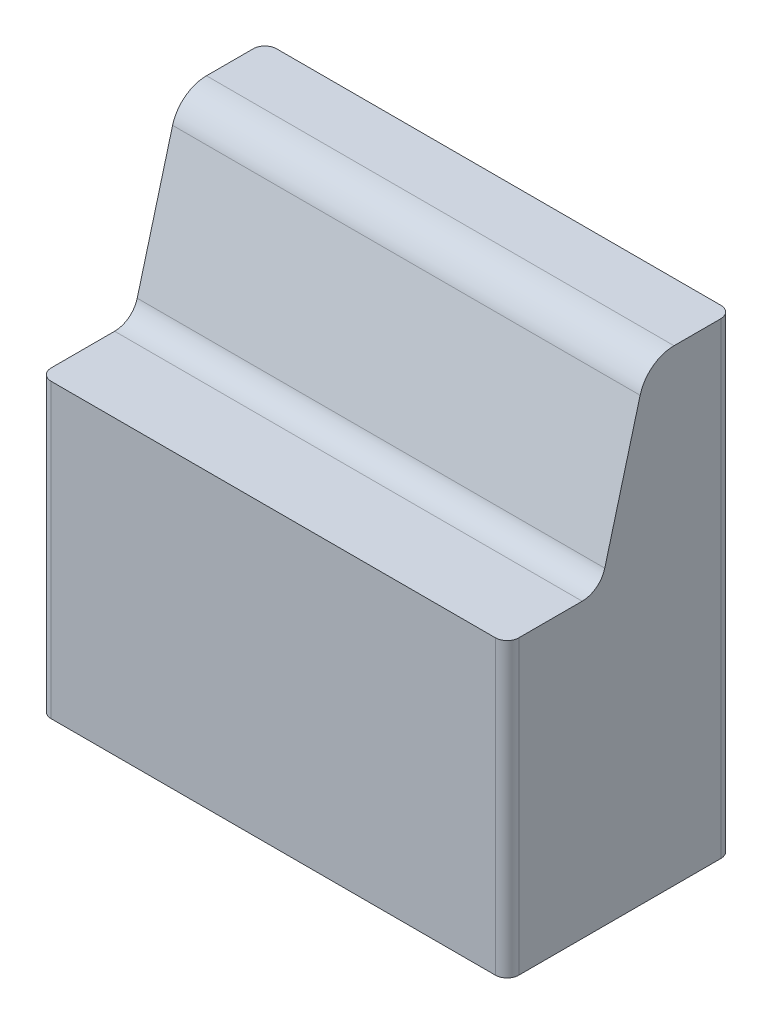
ISO-10303-21;
HEADER;
FILE_DESCRIPTION(('STEP AP214'),'2;1');
FILE_NAME('part.step','',(''),(''),'','','');
FILE_SCHEMA(('AUTOMOTIVE_DESIGN { 1 0 10303 214 1 1 1 1 }'));
ENDSEC;
DATA;
#1=APPLICATION_CONTEXT('core data for automotive mechanical design processes');
#2=APPLICATION_PROTOCOL_DEFINITION('international standard','automotive_design',2000,#1);
#3=PRODUCT_CONTEXT('',#1,'mechanical');
#4=PRODUCT('Part','Part','',(#3));
#5=PRODUCT_RELATED_PRODUCT_CATEGORY('part','',(#4));
#6=PRODUCT_DEFINITION_FORMATION('','',#4);
#7=PRODUCT_DEFINITION_CONTEXT('part definition',#1,'design');
#8=PRODUCT_DEFINITION('design','',#6,#7);
#9=PRODUCT_DEFINITION_SHAPE('','',#8);
#10=(LENGTH_UNIT() NAMED_UNIT(*) SI_UNIT(.MILLI.,.METRE.));
#11=(NAMED_UNIT(*) PLANE_ANGLE_UNIT() SI_UNIT($,.RADIAN.));
#12=(NAMED_UNIT(*) SI_UNIT($,.STERADIAN.) SOLID_ANGLE_UNIT());
#13=UNCERTAINTY_MEASURE_WITH_UNIT(LENGTH_MEASURE(1.E-05),#10,'distance_accuracy_value','');
#14=(GEOMETRIC_REPRESENTATION_CONTEXT(3) GLOBAL_UNCERTAINTY_ASSIGNED_CONTEXT((#13)) GLOBAL_UNIT_ASSIGNED_CONTEXT((#10,
#11,#12)) REPRESENTATION_CONTEXT('',''));
#15=CARTESIAN_POINT('',(0.,0.,0.));
#16=DIRECTION('',(0.,0.,1.));
#17=DIRECTION('',(1.,0.,0.));
#18=AXIS2_PLACEMENT_3D('',#15,#16,#17);
#19=CARTESIAN_POINT('',(20.,-3.,5.));
#20=DIRECTION('',(-1.,0.,0.));
#21=DIRECTION('',(0.,0.,1.));
#22=AXIS2_PLACEMENT_3D('',#19,#20,#21);
#23=CYLINDRICAL_SURFACE('',#22,3.);
#24=CARTESIAN_POINT('',(-20.,-3.,5.));
#25=DIRECTION('',(1.,0.,0.));
#26=DIRECTION('',(0.,0.,1.));
#27=AXIS2_PLACEMENT_3D('',#24,#25,#26);
#28=CIRCLE('',#27,3.);
#29=CARTESIAN_POINT('',(-20.,0.,5.));
#30=VERTEX_POINT('',#29);
#31=CARTESIAN_POINT('',(-20.,-2.22354286469243,7.8977774788672));
#32=VERTEX_POINT('',#31);
#33=EDGE_CURVE('E167',#30,#32,#28,.T.);
#34=ORIENTED_EDGE('',*,*,#33,.T.);
#35=DIRECTION('',(-1.,0.,0.));
#36=VECTOR('',#35,1.);
#37=CARTESIAN_POINT('',(20.,-2.22354286469243,7.8977774788672));
#38=LINE('',#37,#36);
#39=CARTESIAN_POINT('',(20.,-2.22354286469243,7.8977774788672));
#40=VERTEX_POINT('',#39);
#41=EDGE_CURVE('E206',#40,#32,#38,.T.);
#42=ORIENTED_EDGE('',*,*,#41,.F.);
#43=CARTESIAN_POINT('',(20.,-3.,5.));
#44=DIRECTION('',(1.,0.,0.));
#45=DIRECTION('',(0.,0.,1.));
#46=AXIS2_PLACEMENT_3D('',#43,#44,#45);
#47=CIRCLE('',#46,3.);
#48=CARTESIAN_POINT('',(20.,0.,5.));
#49=VERTEX_POINT('',#48);
#50=EDGE_CURVE('E168',#49,#40,#47,.T.);
#51=ORIENTED_EDGE('',*,*,#50,.F.);
#52=DIRECTION('',(-1.,0.,0.));
#53=VECTOR('',#52,1.);
#54=CARTESIAN_POINT('',(20.,0.,5.));
#55=LINE('',#54,#53);
#56=EDGE_CURVE('E181',#49,#30,#55,.T.);
#57=ORIENTED_EDGE('',*,*,#56,.T.);
#58=EDGE_LOOP('',(#34,#42,#51,#57));
#59=FACE_BOUND('',#58,.T.);
#60=ADVANCED_FACE('F50',(#59),#23,.T.);
#61=CARTESIAN_POINT('',(20.,-15.,11.3212188504038));
#62=DIRECTION('',(0.,-0.258819045102525,-0.965925826289067));
#63=DIRECTION('',(0.,0.965925826289067,-0.258819045102525));
#64=AXIS2_PLACEMENT_3D('',#61,#62,#63);
#65=PLANE('',#64);
#66=DIRECTION('',(0.,-0.965925826289067,0.258819045102525));
#67=VECTOR('',#66,1.);
#68=CARTESIAN_POINT('',(-20.,-15.,11.3212188504038));
#69=LINE('',#68,#67);
#70=CARTESIAN_POINT('',(-20.,-13.5176380902051,10.9240211737836));
#71=VERTEX_POINT('',#70);
#72=EDGE_CURVE('E184',#32,#71,#69,.T.);
#73=ORIENTED_EDGE('',*,*,#72,.T.);
#74=DIRECTION('',(-1.,0.,0.));
#75=VECTOR('',#74,1.);
#76=CARTESIAN_POINT('',(20.,-13.5176380902051,10.9240211737836));
#77=LINE('',#76,#75);
#78=CARTESIAN_POINT('',(20.,-13.5176380902051,10.9240211737836));
#79=VERTEX_POINT('',#78);
#80=EDGE_CURVE('E65',#71,#79,#77,.F.);
#81=ORIENTED_EDGE('',*,*,#80,.T.);
#82=DIRECTION('',(0.,-0.965925826289067,0.258819045102525));
#83=VECTOR('',#82,1.);
#84=CARTESIAN_POINT('',(20.,-15.,11.3212188504038));
#85=LINE('',#84,#83);
#86=EDGE_CURVE('E171',#40,#79,#85,.T.);
#87=ORIENTED_EDGE('',*,*,#86,.F.);
#88=ORIENTED_EDGE('',*,*,#41,.T.);
#89=EDGE_LOOP('',(#73,#81,#87,#88));
#90=FACE_BOUND('',#89,.T.);
#91=ADVANCED_FACE('F302',(#90),#65,.F.);
#92=CARTESIAN_POINT('',(20.,-15.,19.28));
#93=DIRECTION('',(0.,-1.,0.));
#94=DIRECTION('',(0.,0.,-1.));
#95=AXIS2_PLACEMENT_3D('',#92,#93,#94);
#96=PLANE('',#95);
#97=DIRECTION('',(0.,0.,1.));
#98=VECTOR('',#97,1.);
#99=CARTESIAN_POINT('',(20.,-15.,19.28));
#100=LINE('',#99,#98);
#101=CARTESIAN_POINT('',(20.,-15.,12.8558728263617));
#102=VERTEX_POINT('',#101);
#103=CARTESIAN_POINT('',(20.,-15.,18.28));
#104=VERTEX_POINT('',#103);
#105=EDGE_CURVE('E174',#102,#104,#100,.T.);
#106=ORIENTED_EDGE('',*,*,#105,.F.);
#107=DIRECTION('',(-1.,0.,0.));
#108=VECTOR('',#107,1.);
#109=CARTESIAN_POINT('',(-20.,-15.,12.8558728263617));
#110=LINE('',#109,#108);
#111=CARTESIAN_POINT('',(-20.,-15.,12.8558728263617));
#112=VERTEX_POINT('',#111);
#113=EDGE_CURVE('E247',#102,#112,#110,.T.);
#114=ORIENTED_EDGE('',*,*,#113,.T.);
#115=DIRECTION('',(0.,0.,1.));
#116=VECTOR('',#115,1.);
#117=CARTESIAN_POINT('',(-20.,-15.,19.28));
#118=LINE('',#117,#116);
#119=CARTESIAN_POINT('',(-20.,-15.,18.28));
#120=VERTEX_POINT('',#119);
#121=EDGE_CURVE('E186',#112,#120,#118,.T.);
#122=ORIENTED_EDGE('',*,*,#121,.T.);
#123=CARTESIAN_POINT('',(-19.,-15.,18.28));
#124=DIRECTION('',(0.,-1.,0.));
#125=DIRECTION('',(0.,0.,-1.));
#126=AXIS2_PLACEMENT_3D('',#123,#124,#125);
#127=CIRCLE('',#126,1.);
#128=CARTESIAN_POINT('',(-19.,-15.,19.28));
#129=VERTEX_POINT('',#128);
#130=EDGE_CURVE('E239',#120,#129,#127,.F.);
#131=ORIENTED_EDGE('',*,*,#130,.T.);
#132=DIRECTION('',(-1.,0.,0.));
#133=VECTOR('',#132,1.);
#134=CARTESIAN_POINT('',(20.,-15.,19.28));
#135=LINE('',#134,#133);
#136=CARTESIAN_POINT('',(19.,-15.,19.28));
#137=VERTEX_POINT('',#136);
#138=EDGE_CURVE('E203',#137,#129,#135,.T.);
#139=ORIENTED_EDGE('',*,*,#138,.F.);
#140=CARTESIAN_POINT('',(19.,-15.,18.28));
#141=DIRECTION('',(0.,-1.,0.));
#142=DIRECTION('',(0.,0.,-1.));
#143=AXIS2_PLACEMENT_3D('',#140,#141,#142);
#144=CIRCLE('',#143,1.);
#145=EDGE_CURVE('E236',#137,#104,#144,.F.);
#146=ORIENTED_EDGE('',*,*,#145,.T.);
#147=EDGE_LOOP('',(#106,#114,#122,#131,#139,#146));
#148=FACE_BOUND('',#147,.T.);
#149=ADVANCED_FACE('F253',(#148),#96,.F.);
#150=CARTESIAN_POINT('',(20.,-40.,19.28));
#151=DIRECTION('',(0.,0.,-1.));
#152=DIRECTION('',(-1.,0.,0.));
#153=AXIS2_PLACEMENT_3D('',#150,#151,#152);
#154=PLANE('',#153);
#155=ORIENTED_EDGE('',*,*,#138,.T.);
#156=DIRECTION('',(0.,-1.,0.));
#157=VECTOR('',#156,1.);
#158=CARTESIAN_POINT('',(-19.,-40.,19.28));
#159=LINE('',#158,#157);
#160=CARTESIAN_POINT('',(-19.,-40.,19.28));
#161=VERTEX_POINT('',#160);
#162=EDGE_CURVE('E233',#129,#161,#159,.T.);
#163=ORIENTED_EDGE('',*,*,#162,.T.);
#164=DIRECTION('',(-1.,0.,0.));
#165=VECTOR('',#164,1.);
#166=CARTESIAN_POINT('',(20.,-40.,19.28));
#167=LINE('',#166,#165);
#168=CARTESIAN_POINT('',(19.,-40.,19.28));
#169=VERTEX_POINT('',#168);
#170=EDGE_CURVE('E200',#169,#161,#167,.T.);
#171=ORIENTED_EDGE('',*,*,#170,.F.);
#172=DIRECTION('',(0.,-1.,0.));
#173=VECTOR('',#172,1.);
#174=CARTESIAN_POINT('',(19.,-40.,19.28));
#175=LINE('',#174,#173);
#176=EDGE_CURVE('E231',#169,#137,#175,.F.);
#177=ORIENTED_EDGE('',*,*,#176,.T.);
#178=EDGE_LOOP('',(#155,#163,#171,#177));
#179=FACE_BOUND('',#178,.T.);
#180=ADVANCED_FACE('F267',(#179),#154,.F.);
#181=CARTESIAN_POINT('',(20.,-40.,0.));
#182=DIRECTION('',(0.,1.,0.));
#183=DIRECTION('',(0.,0.,1.));
#184=AXIS2_PLACEMENT_3D('',#181,#182,#183);
#185=PLANE('',#184);
#186=CARTESIAN_POINT('',(12.5,-40.,7.49999999999999));
#187=DIRECTION('',(0.,-1.,0.));
#188=DIRECTION('',(0.,0.,-1.));
#189=AXIS2_PLACEMENT_3D('',#186,#187,#188);
#190=CIRCLE('',#189,3.025);
#191=CARTESIAN_POINT('',(12.5,-40.,4.47499999999999));
#192=VERTEX_POINT('',#191);
#193=EDGE_CURVE('E158',#192,#192,#190,.T.);
#194=ORIENTED_EDGE('',*,*,#193,.F.);
#195=EDGE_LOOP('',(#194));
#196=FACE_BOUND('',#195,.T.);
#197=CARTESIAN_POINT('',(-12.5,-40.,7.49999999999999));
#198=DIRECTION('',(0.,-1.,0.));
#199=DIRECTION('',(0.,0.,-1.));
#200=AXIS2_PLACEMENT_3D('',#197,#198,#199);
#201=CIRCLE('',#200,3.025);
#202=CARTESIAN_POINT('',(-12.5,-40.,4.47499999999999));
#203=VERTEX_POINT('',#202);
#204=EDGE_CURVE('E151',#203,#203,#201,.T.);
#205=ORIENTED_EDGE('',*,*,#204,.F.);
#206=EDGE_LOOP('',(#205));
#207=FACE_BOUND('',#206,.T.);
#208=DIRECTION('',(0.,0.,-1.));
#209=VECTOR('',#208,1.);
#210=CARTESIAN_POINT('',(-20.,-40.,0.));
#211=LINE('',#210,#209);
#212=CARTESIAN_POINT('',(-20.,-40.,18.28));
#213=VERTEX_POINT('',#212);
#214=CARTESIAN_POINT('',(-20.,-40.,0.999999999999995));
#215=VERTEX_POINT('',#214);
#216=EDGE_CURVE('E188',#213,#215,#211,.T.);
#217=ORIENTED_EDGE('',*,*,#216,.T.);
#218=CARTESIAN_POINT('',(-19.,-40.,0.999999999999995));
#219=DIRECTION('',(0.,1.,0.));
#220=DIRECTION('',(0.,0.,1.));
#221=AXIS2_PLACEMENT_3D('',#218,#219,#220);
#222=CIRCLE('',#221,1.);
#223=CARTESIAN_POINT('',(-19.,-40.,0.));
#224=VERTEX_POINT('',#223);
#225=EDGE_CURVE('E229',#215,#224,#222,.F.);
#226=ORIENTED_EDGE('',*,*,#225,.T.);
#227=DIRECTION('',(-1.,0.,0.));
#228=VECTOR('',#227,1.);
#229=CARTESIAN_POINT('',(20.,-40.,0.));
#230=LINE('',#229,#228);
#231=CARTESIAN_POINT('',(19.,-40.,0.));
#232=VERTEX_POINT('',#231);
#233=EDGE_CURVE('E197',#232,#224,#230,.T.);
#234=ORIENTED_EDGE('',*,*,#233,.F.);
#235=CARTESIAN_POINT('',(19.,-40.,0.999999999999995));
#236=DIRECTION('',(0.,1.,0.));
#237=DIRECTION('',(0.,0.,1.));
#238=AXIS2_PLACEMENT_3D('',#235,#236,#237);
#239=CIRCLE('',#238,1.);
#240=CARTESIAN_POINT('',(20.,-40.,0.999999999999995));
#241=VERTEX_POINT('',#240);
#242=EDGE_CURVE('E225',#232,#241,#239,.F.);
#243=ORIENTED_EDGE('',*,*,#242,.T.);
#244=DIRECTION('',(0.,0.,-1.));
#245=VECTOR('',#244,1.);
#246=CARTESIAN_POINT('',(20.,-40.,0.));
#247=LINE('',#246,#245);
#248=CARTESIAN_POINT('',(20.,-40.,18.28));
#249=VERTEX_POINT('',#248);
#250=EDGE_CURVE('E176',#249,#241,#247,.T.);
#251=ORIENTED_EDGE('',*,*,#250,.F.);
#252=CARTESIAN_POINT('',(19.,-40.,18.28));
#253=DIRECTION('',(0.,1.,0.));
#254=DIRECTION('',(0.,0.,1.));
#255=AXIS2_PLACEMENT_3D('',#252,#253,#254);
#256=CIRCLE('',#255,1.);
#257=EDGE_CURVE('E223',#249,#169,#256,.F.);
#258=ORIENTED_EDGE('',*,*,#257,.T.);
#259=ORIENTED_EDGE('',*,*,#170,.T.);
#260=CARTESIAN_POINT('',(-19.,-40.,18.28));
#261=DIRECTION('',(0.,1.,0.));
#262=DIRECTION('',(0.,0.,1.));
#263=AXIS2_PLACEMENT_3D('',#260,#261,#262);
#264=CIRCLE('',#263,1.);
#265=EDGE_CURVE('E227',#161,#213,#264,.F.);
#266=ORIENTED_EDGE('',*,*,#265,.T.);
#267=EDGE_LOOP('',(#217,#226,#234,#243,#251,#258,#259,#266));
#268=FACE_BOUND('',#267,.T.);
#269=ADVANCED_FACE('F278',(#196,#207,#268),#185,.F.);
#270=CARTESIAN_POINT('',(20.,0.,0.));
#271=DIRECTION('',(0.,0.,1.));
#272=DIRECTION('',(0.,-1.,0.));
#273=AXIS2_PLACEMENT_3D('',#270,#271,#272);
#274=PLANE('',#273);
#275=ORIENTED_EDGE('',*,*,#233,.T.);
#276=DIRECTION('',(0.,1.,0.));
#277=VECTOR('',#276,1.);
#278=CARTESIAN_POINT('',(-19.,0.,0.));
#279=LINE('',#278,#277);
#280=CARTESIAN_POINT('',(-19.,0.,0.));
#281=VERTEX_POINT('',#280);
#282=EDGE_CURVE('E211',#224,#281,#279,.T.);
#283=ORIENTED_EDGE('',*,*,#282,.T.);
#284=DIRECTION('',(-1.,0.,0.));
#285=VECTOR('',#284,1.);
#286=CARTESIAN_POINT('',(20.,0.,0.));
#287=LINE('',#286,#285);
#288=CARTESIAN_POINT('',(19.,0.,0.));
#289=VERTEX_POINT('',#288);
#290=EDGE_CURVE('E194',#289,#281,#287,.T.);
#291=ORIENTED_EDGE('',*,*,#290,.F.);
#292=DIRECTION('',(0.,1.,0.));
#293=VECTOR('',#292,1.);
#294=CARTESIAN_POINT('',(19.,0.,0.));
#295=LINE('',#294,#293);
#296=EDGE_CURVE('E209',#289,#232,#295,.F.);
#297=ORIENTED_EDGE('',*,*,#296,.T.);
#298=EDGE_LOOP('',(#275,#283,#291,#297));
#299=FACE_BOUND('',#298,.T.);
#300=ADVANCED_FACE('F341',(#299),#274,.F.);
#301=CARTESIAN_POINT('',(20.,0.,5.));
#302=DIRECTION('',(0.,-1.,0.));
#303=DIRECTION('',(0.,0.,-1.));
#304=AXIS2_PLACEMENT_3D('',#301,#302,#303);
#305=PLANE('',#304);
#306=ORIENTED_EDGE('',*,*,#290,.T.);
#307=CARTESIAN_POINT('',(-19.,0.,1.));
#308=DIRECTION('',(0.,-1.,0.));
#309=DIRECTION('',(0.,0.,-1.));
#310=AXIS2_PLACEMENT_3D('',#307,#308,#309);
#311=CIRCLE('',#310,1.);
#312=CARTESIAN_POINT('',(-20.,0.,1.));
#313=VERTEX_POINT('',#312);
#314=EDGE_CURVE('E216',#281,#313,#311,.F.);
#315=ORIENTED_EDGE('',*,*,#314,.T.);
#316=DIRECTION('',(0.,0.,1.));
#317=VECTOR('',#316,1.);
#318=CARTESIAN_POINT('',(-20.,0.,5.));
#319=LINE('',#318,#317);
#320=EDGE_CURVE('E172',#313,#30,#319,.T.);
#321=ORIENTED_EDGE('',*,*,#320,.T.);
#322=ORIENTED_EDGE('',*,*,#56,.F.);
#323=DIRECTION('',(0.,0.,1.));
#324=VECTOR('',#323,1.);
#325=CARTESIAN_POINT('',(20.,0.,5.));
#326=LINE('',#325,#324);
#327=CARTESIAN_POINT('',(20.,0.,1.));
#328=VERTEX_POINT('',#327);
#329=EDGE_CURVE('E179',#328,#49,#326,.T.);
#330=ORIENTED_EDGE('',*,*,#329,.F.);
#331=CARTESIAN_POINT('',(19.,0.,1.));
#332=DIRECTION('',(0.,-1.,0.));
#333=DIRECTION('',(0.,0.,-1.));
#334=AXIS2_PLACEMENT_3D('',#331,#332,#333);
#335=CIRCLE('',#334,1.);
#336=EDGE_CURVE('E214',#328,#289,#335,.F.);
#337=ORIENTED_EDGE('',*,*,#336,.T.);
#338=EDGE_LOOP('',(#306,#315,#321,#322,#330,#337));
#339=FACE_BOUND('',#338,.T.);
#340=ADVANCED_FACE('F287',(#339),#305,.F.);
#341=CARTESIAN_POINT('',(20.,-3.,5.));
#342=DIRECTION('',(-1.,0.,0.));
#343=DIRECTION('',(0.,0.,1.));
#344=AXIS2_PLACEMENT_3D('',#341,#342,#343);
#345=PLANE('',#344);
#346=ORIENTED_EDGE('',*,*,#250,.T.);
#347=DIRECTION('',(0.,1.,0.));
#348=VECTOR('',#347,1.);
#349=CARTESIAN_POINT('',(20.,-3.,1.));
#350=LINE('',#349,#348);
#351=EDGE_CURVE('E244',#241,#328,#350,.T.);
#352=ORIENTED_EDGE('',*,*,#351,.T.);
#353=ORIENTED_EDGE('',*,*,#329,.T.);
#354=ORIENTED_EDGE('',*,*,#50,.T.);
#355=ORIENTED_EDGE('',*,*,#86,.T.);
#356=CARTESIAN_POINT('',(20.,-13.,12.8558728263617));
#357=DIRECTION('',(-1.,0.,0.));
#358=DIRECTION('',(0.,0.,1.));
#359=AXIS2_PLACEMENT_3D('',#356,#357,#358);
#360=CIRCLE('',#359,2.);
#361=EDGE_CURVE('E11',#79,#102,#360,.T.);
#362=ORIENTED_EDGE('',*,*,#361,.T.);
#363=ORIENTED_EDGE('',*,*,#105,.T.);
#364=DIRECTION('',(0.,-1.,0.));
#365=VECTOR('',#364,1.);
#366=CARTESIAN_POINT('',(20.,-3.,18.28));
#367=LINE('',#366,#365);
#368=EDGE_CURVE('E241',#104,#249,#367,.T.);
#369=ORIENTED_EDGE('',*,*,#368,.T.);
#370=EDGE_LOOP('',(#346,#352,#353,#354,#355,#362,#363,#369));
#371=FACE_BOUND('',#370,.T.);
#372=ADVANCED_FACE('F275',(#371),#345,.F.);
#373=CARTESIAN_POINT('',(-20.,-3.,5.));
#374=DIRECTION('',(-1.,0.,0.));
#375=DIRECTION('',(0.,0.,1.));
#376=AXIS2_PLACEMENT_3D('',#373,#374,#375);
#377=PLANE('',#376);
#378=ORIENTED_EDGE('',*,*,#320,.F.);
#379=DIRECTION('',(0.,1.,0.));
#380=VECTOR('',#379,1.);
#381=CARTESIAN_POINT('',(-20.,-40.,0.999999999999995));
#382=LINE('',#381,#380);
#383=EDGE_CURVE('E221',#313,#215,#382,.F.);
#384=ORIENTED_EDGE('',*,*,#383,.T.);
#385=ORIENTED_EDGE('',*,*,#216,.F.);
#386=DIRECTION('',(0.,-1.,0.));
#387=VECTOR('',#386,1.);
#388=CARTESIAN_POINT('',(-20.,-15.,18.28));
#389=LINE('',#388,#387);
#390=EDGE_CURVE('E218',#213,#120,#389,.F.);
#391=ORIENTED_EDGE('',*,*,#390,.T.);
#392=ORIENTED_EDGE('',*,*,#121,.F.);
#393=CARTESIAN_POINT('',(-20.,-13.,12.8558728263617));
#394=DIRECTION('',(-1.,0.,0.));
#395=DIRECTION('',(0.,0.,1.));
#396=AXIS2_PLACEMENT_3D('',#393,#394,#395);
#397=CIRCLE('',#396,2.);
#398=EDGE_CURVE('E58',#112,#71,#397,.F.);
#399=ORIENTED_EDGE('',*,*,#398,.T.);
#400=ORIENTED_EDGE('',*,*,#72,.F.);
#401=ORIENTED_EDGE('',*,*,#33,.F.);
#402=EDGE_LOOP('',(#378,#384,#385,#391,#392,#399,#400,#401));
#403=FACE_BOUND('',#402,.T.);
#404=ADVANCED_FACE('F257',(#403),#377,.T.);
#405=CARTESIAN_POINT('',(-19.,0.,1.));
#406=DIRECTION('',(0.,-1.,0.));
#407=DIRECTION('',(0.,0.,-1.));
#408=AXIS2_PLACEMENT_3D('',#405,#406,#407);
#409=CYLINDRICAL_SURFACE('',#408,1.);
#410=ORIENTED_EDGE('',*,*,#225,.F.);
#411=ORIENTED_EDGE('',*,*,#383,.F.);
#412=ORIENTED_EDGE('',*,*,#314,.F.);
#413=ORIENTED_EDGE('',*,*,#282,.F.);
#414=EDGE_LOOP('',(#410,#411,#412,#413));
#415=FACE_BOUND('',#414,.T.);
#416=ADVANCED_FACE('F311',(#415),#409,.T.);
#417=CARTESIAN_POINT('',(-19.,-40.,18.28));
#418=DIRECTION('',(0.,1.,0.));
#419=DIRECTION('',(0.,0.,1.));
#420=AXIS2_PLACEMENT_3D('',#417,#418,#419);
#421=CYLINDRICAL_SURFACE('',#420,1.);
#422=ORIENTED_EDGE('',*,*,#130,.F.);
#423=ORIENTED_EDGE('',*,*,#390,.F.);
#424=ORIENTED_EDGE('',*,*,#265,.F.);
#425=ORIENTED_EDGE('',*,*,#162,.F.);
#426=EDGE_LOOP('',(#422,#423,#424,#425));
#427=FACE_BOUND('',#426,.T.);
#428=ADVANCED_FACE('F263',(#427),#421,.T.);
#429=CARTESIAN_POINT('',(19.,-3.,1.));
#430=DIRECTION('',(0.,1.,0.));
#431=DIRECTION('',(0.,0.,1.));
#432=AXIS2_PLACEMENT_3D('',#429,#430,#431);
#433=CYLINDRICAL_SURFACE('',#432,1.);
#434=ORIENTED_EDGE('',*,*,#242,.F.);
#435=ORIENTED_EDGE('',*,*,#296,.F.);
#436=ORIENTED_EDGE('',*,*,#336,.F.);
#437=ORIENTED_EDGE('',*,*,#351,.F.);
#438=EDGE_LOOP('',(#434,#435,#436,#437));
#439=FACE_BOUND('',#438,.T.);
#440=ADVANCED_FACE('F283',(#439),#433,.T.);
#441=CARTESIAN_POINT('',(19.,-3.,18.28));
#442=DIRECTION('',(0.,-1.,0.));
#443=DIRECTION('',(0.,0.,-1.));
#444=AXIS2_PLACEMENT_3D('',#441,#442,#443);
#445=CYLINDRICAL_SURFACE('',#444,1.);
#446=ORIENTED_EDGE('',*,*,#145,.F.);
#447=ORIENTED_EDGE('',*,*,#176,.F.);
#448=ORIENTED_EDGE('',*,*,#257,.F.);
#449=ORIENTED_EDGE('',*,*,#368,.F.);
#450=EDGE_LOOP('',(#446,#447,#448,#449));
#451=FACE_BOUND('',#450,.T.);
#452=ADVANCED_FACE('F271',(#451),#445,.T.);
#453=CARTESIAN_POINT('',(-12.5,-23.,7.49999999999999));
#454=DIRECTION('',(0.,-1.,0.));
#455=DIRECTION('',(0.,0.,-1.));
#456=AXIS2_PLACEMENT_3D('',#453,#454,#455);
#457=CONICAL_SURFACE('',#456,2.49999999999999,1.02974425867665);
#458=CARTESIAN_POINT('',(-12.5,-21.4978484524311,7.49999999999999));
#459=VERTEX_POINT('',#458);
#460=VERTEX_LOOP('',#459);
#461=FACE_BOUND('',#460,.T.);
#462=CARTESIAN_POINT('',(-12.5,-23.,7.49999999999999));
#463=DIRECTION('',(0.,-1.,0.));
#464=DIRECTION('',(0.,0.,-1.));
#465=AXIS2_PLACEMENT_3D('',#462,#463,#464);
#466=CIRCLE('',#465,2.49999999999999);
#467=CARTESIAN_POINT('',(-12.5,-23.,5.00000000000001));
#468=VERTEX_POINT('',#467);
#469=EDGE_CURVE('E164',#468,#468,#466,.T.);
#470=ORIENTED_EDGE('',*,*,#469,.T.);
#471=EDGE_LOOP('',(#470));
#472=FACE_BOUND('',#471,.T.);
#473=ADVANCED_FACE('F319',(#461,#472),#457,.F.);
#474=CARTESIAN_POINT('',(-12.5,-40.,7.49999999999999));
#475=DIRECTION('',(0.,-1.,0.));
#476=DIRECTION('',(0.,0.,-1.));
#477=AXIS2_PLACEMENT_3D('',#474,#475,#476);
#478=CYLINDRICAL_SURFACE('',#477,2.49999999999999);
#479=ORIENTED_EDGE('',*,*,#469,.F.);
#480=EDGE_LOOP('',(#479));
#481=FACE_BOUND('',#480,.T.);
#482=CARTESIAN_POINT('',(-12.5,-39.475,7.49999999999999));
#483=DIRECTION('',(0.,-1.,0.));
#484=DIRECTION('',(0.,0.,-1.));
#485=AXIS2_PLACEMENT_3D('',#482,#483,#484);
#486=CIRCLE('',#485,2.49999999999999);
#487=CARTESIAN_POINT('',(-12.5,-39.475,5.));
#488=VERTEX_POINT('',#487);
#489=EDGE_CURVE('E155',#488,#488,#486,.T.);
#490=ORIENTED_EDGE('',*,*,#489,.T.);
#491=EDGE_LOOP('',(#490));
#492=FACE_BOUND('',#491,.T.);
#493=ADVANCED_FACE('F324',(#481,#492),#478,.F.);
#494=CARTESIAN_POINT('',(-12.5,-40.,7.49999999999999));
#495=DIRECTION('',(0.,-1.,0.));
#496=DIRECTION('',(0.,0.,-1.));
#497=AXIS2_PLACEMENT_3D('',#494,#495,#496);
#498=CONICAL_SURFACE('',#497,3.025,0.785398163397447);
#499=ORIENTED_EDGE('',*,*,#489,.F.);
#500=EDGE_LOOP('',(#499));
#501=FACE_BOUND('',#500,.T.);
#502=ORIENTED_EDGE('',*,*,#204,.T.);
#503=EDGE_LOOP('',(#502));
#504=FACE_BOUND('',#503,.T.);
#505=ADVANCED_FACE('F145',(#501,#504),#498,.F.);
#506=CARTESIAN_POINT('',(12.5,-23.,7.49999999999999));
#507=DIRECTION('',(0.,-1.,0.));
#508=DIRECTION('',(0.,0.,-1.));
#509=AXIS2_PLACEMENT_3D('',#506,#507,#508);
#510=CONICAL_SURFACE('',#509,2.49999999999999,1.02974425867665);
#511=CARTESIAN_POINT('',(12.5,-21.4978484524311,7.49999999999999));
#512=VERTEX_POINT('',#511);
#513=VERTEX_LOOP('',#512);
#514=FACE_BOUND('',#513,.T.);
#515=CARTESIAN_POINT('',(12.5,-23.,7.49999999999999));
#516=DIRECTION('',(0.,-1.,0.));
#517=DIRECTION('',(0.,0.,-1.));
#518=AXIS2_PLACEMENT_3D('',#515,#516,#517);
#519=CIRCLE('',#518,2.49999999999999);
#520=CARTESIAN_POINT('',(12.5,-23.,5.00000000000001));
#521=VERTEX_POINT('',#520);
#522=EDGE_CURVE('E149',#521,#521,#519,.T.);
#523=ORIENTED_EDGE('',*,*,#522,.T.);
#524=EDGE_LOOP('',(#523));
#525=FACE_BOUND('',#524,.T.);
#526=ADVANCED_FACE('F141',(#514,#525),#510,.F.);
#527=CARTESIAN_POINT('',(12.5,-40.,7.49999999999999));
#528=DIRECTION('',(0.,-1.,0.));
#529=DIRECTION('',(0.,0.,-1.));
#530=AXIS2_PLACEMENT_3D('',#527,#528,#529);
#531=CYLINDRICAL_SURFACE('',#530,2.49999999999999);
#532=ORIENTED_EDGE('',*,*,#522,.F.);
#533=EDGE_LOOP('',(#532));
#534=FACE_BOUND('',#533,.T.);
#535=CARTESIAN_POINT('',(12.5,-39.475,7.49999999999999));
#536=DIRECTION('',(0.,-1.,0.));
#537=DIRECTION('',(0.,0.,-1.));
#538=AXIS2_PLACEMENT_3D('',#535,#536,#537);
#539=CIRCLE('',#538,2.49999999999999);
#540=CARTESIAN_POINT('',(12.5,-39.475,5.));
#541=VERTEX_POINT('',#540);
#542=EDGE_CURVE('E152',#541,#541,#539,.T.);
#543=ORIENTED_EDGE('',*,*,#542,.T.);
#544=EDGE_LOOP('',(#543));
#545=FACE_BOUND('',#544,.T.);
#546=ADVANCED_FACE('F144',(#534,#545),#531,.F.);
#547=CARTESIAN_POINT('',(12.5,-40.,7.49999999999999));
#548=DIRECTION('',(0.,-1.,0.));
#549=DIRECTION('',(0.,0.,-1.));
#550=AXIS2_PLACEMENT_3D('',#547,#548,#549);
#551=CONICAL_SURFACE('',#550,3.025,0.785398163397447);
#552=ORIENTED_EDGE('',*,*,#542,.F.);
#553=EDGE_LOOP('',(#552));
#554=FACE_BOUND('',#553,.T.);
#555=ORIENTED_EDGE('',*,*,#193,.T.);
#556=EDGE_LOOP('',(#555));
#557=FACE_BOUND('',#556,.T.);
#558=ADVANCED_FACE('F294',(#554,#557),#551,.F.);
#559=CARTESIAN_POINT('',(20.,-13.,12.8558728263617));
#560=DIRECTION('',(1.,0.,0.));
#561=DIRECTION('',(0.,0.,-1.));
#562=AXIS2_PLACEMENT_3D('',#559,#560,#561);
#563=CYLINDRICAL_SURFACE('',#562,2.);
#564=ORIENTED_EDGE('',*,*,#361,.F.);
#565=ORIENTED_EDGE('',*,*,#80,.F.);
#566=ORIENTED_EDGE('',*,*,#398,.F.);
#567=ORIENTED_EDGE('',*,*,#113,.F.);
#568=EDGE_LOOP('',(#564,#565,#566,#567));
#569=FACE_BOUND('',#568,.T.);
#570=ADVANCED_FACE('F52',(#569),#563,.F.);
#571=CLOSED_SHELL('',(#60,#91,#149,#180,#269,#300,#340,#372,#404,#416,#428,#440,#452,#473,#493,
#505,#526,#546,#558,#570));
#572=MANIFOLD_SOLID_BREP('B2',#571);
#573=ADVANCED_BREP_SHAPE_REPRESENTATION('',(#18,#572),#14);
#574=SHAPE_DEFINITION_REPRESENTATION(#9,#573);
ENDSEC;
END-ISO-10303-21;
